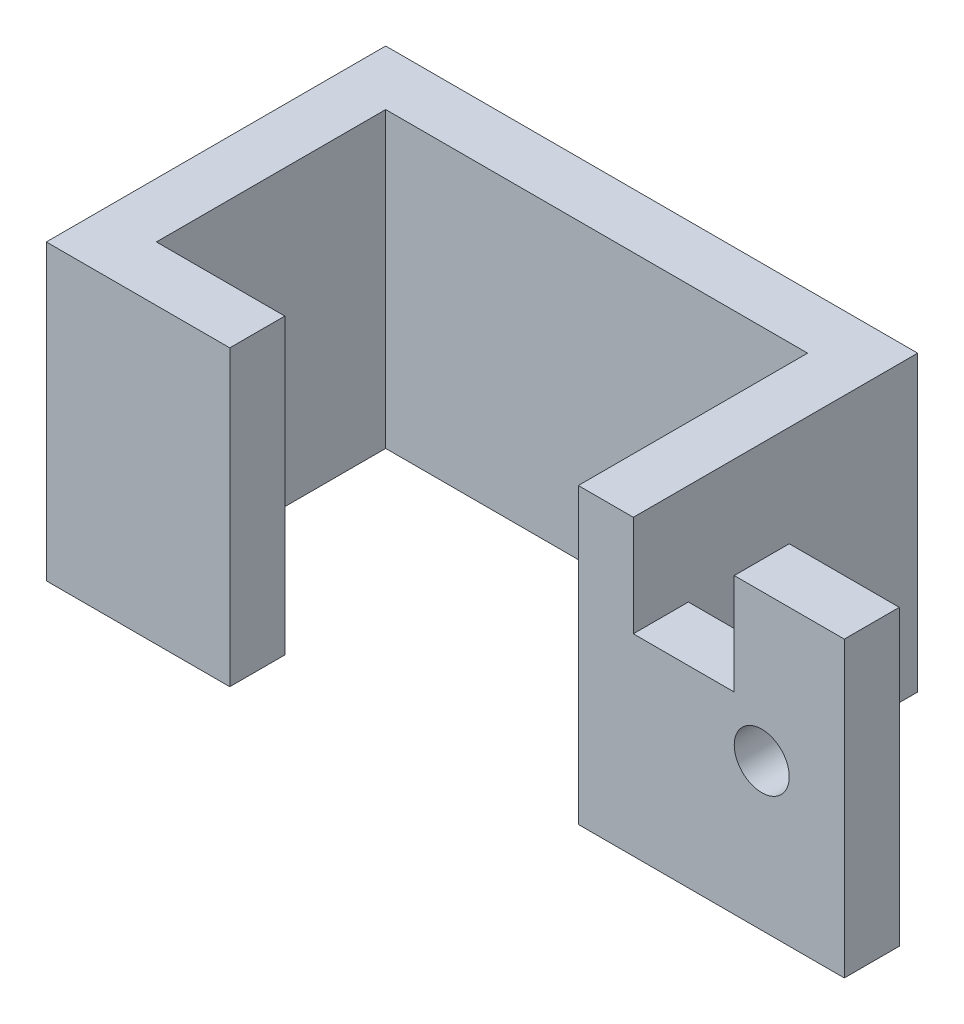
ISO-10303-21;
HEADER;
FILE_DESCRIPTION(('STEP AP214'),'2;1');
FILE_NAME('part.step','',(''),(''),'','','');
FILE_SCHEMA(('AUTOMOTIVE_DESIGN { 1 0 10303 214 1 1 1 1 }'));
ENDSEC;
DATA;
#1=APPLICATION_CONTEXT('core data for automotive mechanical design processes');
#2=APPLICATION_PROTOCOL_DEFINITION('international standard','automotive_design',2000,#1);
#3=PRODUCT_CONTEXT('',#1,'mechanical');
#4=PRODUCT('Part','Part','',(#3));
#5=PRODUCT_RELATED_PRODUCT_CATEGORY('part','',(#4));
#6=PRODUCT_DEFINITION_FORMATION('','',#4);
#7=PRODUCT_DEFINITION_CONTEXT('part definition',#1,'design');
#8=PRODUCT_DEFINITION('design','',#6,#7);
#9=PRODUCT_DEFINITION_SHAPE('','',#8);
#10=(LENGTH_UNIT() NAMED_UNIT(*) SI_UNIT(.MILLI.,.METRE.));
#11=(NAMED_UNIT(*) PLANE_ANGLE_UNIT() SI_UNIT($,.RADIAN.));
#12=(NAMED_UNIT(*) SI_UNIT($,.STERADIAN.) SOLID_ANGLE_UNIT());
#13=UNCERTAINTY_MEASURE_WITH_UNIT(LENGTH_MEASURE(1.E-05),#10,'distance_accuracy_value','');
#14=(GEOMETRIC_REPRESENTATION_CONTEXT(3) GLOBAL_UNCERTAINTY_ASSIGNED_CONTEXT((#13)) GLOBAL_UNIT_ASSIGNED_CONTEXT((#10,
#11,#12)) REPRESENTATION_CONTEXT('',''));
#15=CARTESIAN_POINT('',(0.,0.,0.));
#16=DIRECTION('',(0.,0.,1.));
#17=DIRECTION('',(1.,0.,0.));
#18=AXIS2_PLACEMENT_3D('',#15,#16,#17);
#19=CARTESIAN_POINT('',(0.,16.,0.));
#20=DIRECTION('',(0.,1.,0.));
#21=DIRECTION('',(0.,0.,1.));
#22=AXIS2_PLACEMENT_3D('',#19,#20,#21);
#23=PLANE('',#22);
#24=DIRECTION('',(0.,0.,-1.));
#25=VECTOR('',#24,1.);
#26=CARTESIAN_POINT('',(20.,16.,10.751));
#27=LINE('',#26,#25);
#28=CARTESIAN_POINT('',(20.,16.,7.75));
#29=VERTEX_POINT('',#28);
#30=CARTESIAN_POINT('',(20.,16.,4.75));
#31=VERTEX_POINT('',#30);
#32=EDGE_CURVE('E237',#29,#31,#27,.T.);
#33=ORIENTED_EDGE('',*,*,#32,.F.);
#34=DIRECTION('',(1.,0.,0.));
#35=VECTOR('',#34,1.);
#36=CARTESIAN_POINT('',(-14.5,16.,7.75));
#37=LINE('',#36,#35);
#38=CARTESIAN_POINT('',(26.,16.,7.75));
#39=VERTEX_POINT('',#38);
#40=EDGE_CURVE('E243',#29,#39,#37,.T.);
#41=ORIENTED_EDGE('',*,*,#40,.T.);
#42=DIRECTION('',(0.,0.,-1.));
#43=VECTOR('',#42,1.);
#44=CARTESIAN_POINT('',(26.,16.,7.75100000000001));
#45=LINE('',#44,#43);
#46=CARTESIAN_POINT('',(26.,16.,4.75));
#47=VERTEX_POINT('',#46);
#48=EDGE_CURVE('E291',#39,#47,#45,.T.);
#49=ORIENTED_EDGE('',*,*,#48,.T.);
#50=DIRECTION('',(-1.,0.,0.));
#51=VECTOR('',#50,1.);
#52=CARTESIAN_POINT('',(27.5,16.,4.75));
#53=LINE('',#52,#51);
#54=EDGE_CURVE('E361',#47,#31,#53,.T.);
#55=ORIENTED_EDGE('',*,*,#54,.T.);
#56=EDGE_LOOP('',(#33,#41,#49,#55));
#57=FACE_BOUND('',#56,.T.);
#58=ADVANCED_FACE('F39',(#57),#23,.T.);
#59=CARTESIAN_POINT('',(14.5,16.,-7.75));
#60=DIRECTION('',(-1.,0.,0.));
#61=DIRECTION('',(0.,0.,1.));
#62=AXIS2_PLACEMENT_3D('',#59,#60,#61);
#63=PLANE('',#62);
#64=DIRECTION('',(0.,1.,0.));
#65=VECTOR('',#64,1.);
#66=CARTESIAN_POINT('',(14.5,16.,4.75));
#67=LINE('',#66,#65);
#68=CARTESIAN_POINT('',(14.5,9.,4.75));
#69=VERTEX_POINT('',#68);
#70=CARTESIAN_POINT('',(14.5,10.5,4.75));
#71=VERTEX_POINT('',#70);
#72=EDGE_CURVE('E359',#69,#71,#67,.T.);
#73=ORIENTED_EDGE('',*,*,#72,.F.);
#74=CARTESIAN_POINT('',(14.5,9.,0.75));
#75=DIRECTION('',(-1.,0.,0.));
#76=DIRECTION('',(0.,0.,1.));
#77=AXIS2_PLACEMENT_3D('',#74,#75,#76);
#78=CIRCLE('',#77,4.);
#79=CARTESIAN_POINT('',(14.5,5.,0.749999999999999));
#80=VERTEX_POINT('',#79);
#81=EDGE_CURVE('E420',#69,#80,#78,.F.);
#82=ORIENTED_EDGE('',*,*,#81,.T.);
#83=DIRECTION('',(0.,0.,1.));
#84=VECTOR('',#83,1.);
#85=CARTESIAN_POINT('',(14.5,5.,-1.25));
#86=LINE('',#85,#84);
#87=CARTESIAN_POINT('',(14.5,5.,0.0857864376269022));
#88=VERTEX_POINT('',#87);
#89=EDGE_CURVE('E324',#88,#80,#86,.T.);
#90=ORIENTED_EDGE('',*,*,#89,.F.);
#91=CARTESIAN_POINT('',(14.5,5.,-1.25));
#92=VERTEX_POINT('',#91);
#93=EDGE_CURVE('E316',#92,#88,#86,.T.);
#94=ORIENTED_EDGE('',*,*,#93,.F.);
#95=DIRECTION('',(0.,1.,0.));
#96=VECTOR('',#95,1.);
#97=CARTESIAN_POINT('',(14.5,5.,-1.25));
#98=LINE('',#97,#96);
#99=CARTESIAN_POINT('',(14.5,0.,-1.25));
#100=VERTEX_POINT('',#99);
#101=EDGE_CURVE('E304',#100,#92,#98,.T.);
#102=ORIENTED_EDGE('',*,*,#101,.F.);
#103=DIRECTION('',(0.,0.,-1.));
#104=VECTOR('',#103,1.);
#105=CARTESIAN_POINT('',(14.5,0.,-7.75));
#106=LINE('',#105,#104);
#107=CARTESIAN_POINT('',(14.5,0.,-7.75));
#108=VERTEX_POINT('',#107);
#109=EDGE_CURVE('E391',#100,#108,#106,.T.);
#110=ORIENTED_EDGE('',*,*,#109,.T.);
#111=DIRECTION('',(0.,-1.,0.));
#112=VECTOR('',#111,1.);
#113=CARTESIAN_POINT('',(14.5,16.,-7.75));
#114=LINE('',#113,#112);
#115=CARTESIAN_POINT('',(14.5,16.,-7.75));
#116=VERTEX_POINT('',#115);
#117=EDGE_CURVE('E412',#116,#108,#114,.T.);
#118=ORIENTED_EDGE('',*,*,#117,.F.);
#119=DIRECTION('',(0.,0.,-1.));
#120=VECTOR('',#119,1.);
#121=CARTESIAN_POINT('',(14.5,16.,-7.75));
#122=LINE('',#121,#120);
#123=CARTESIAN_POINT('',(14.5,16.,7.75));
#124=VERTEX_POINT('',#123);
#125=EDGE_CURVE('E392',#124,#116,#122,.T.);
#126=ORIENTED_EDGE('',*,*,#125,.F.);
#127=DIRECTION('',(0.,-1.,0.));
#128=VECTOR('',#127,1.);
#129=CARTESIAN_POINT('',(14.5,10.5,7.75));
#130=LINE('',#129,#128);
#131=CARTESIAN_POINT('',(14.5,10.5,7.75));
#132=VERTEX_POINT('',#131);
#133=EDGE_CURVE('E244',#124,#132,#130,.T.);
#134=ORIENTED_EDGE('',*,*,#133,.T.);
#135=DIRECTION('',(0.,0.,-1.));
#136=VECTOR('',#135,1.);
#137=CARTESIAN_POINT('',(14.5,10.5,10.751));
#138=LINE('',#137,#136);
#139=EDGE_CURVE('E226',#132,#71,#138,.T.);
#140=ORIENTED_EDGE('',*,*,#139,.T.);
#141=EDGE_LOOP('',(#73,#82,#90,#94,#102,#110,#118,#126,#134,#140));
#142=FACE_BOUND('',#141,.T.);
#143=ADVANCED_FACE('F445',(#142),#63,.F.);
#144=CARTESIAN_POINT('',(27.5,16.,4.75));
#145=DIRECTION('',(0.,0.,1.));
#146=DIRECTION('',(0.,-1.,0.));
#147=AXIS2_PLACEMENT_3D('',#144,#145,#146);
#148=PLANE('',#147);
#149=CARTESIAN_POINT('',(21.5,8.,4.75));
#150=DIRECTION('',(0.,0.,-1.));
#151=DIRECTION('',(0.,1.,0.));
#152=AXIS2_PLACEMENT_3D('',#149,#150,#151);
#153=CIRCLE('',#152,1.5);
#154=CARTESIAN_POINT('',(20.3819660112501,9.,4.75));
#155=VERTEX_POINT('',#154);
#156=CARTESIAN_POINT('',(20.5,6.8819660112501,4.75));
#157=VERTEX_POINT('',#156);
#158=EDGE_CURVE('E294',#155,#157,#153,.T.);
#159=ORIENTED_EDGE('',*,*,#158,.F.);
#160=DIRECTION('',(-1.,0.,0.));
#161=VECTOR('',#160,1.);
#162=CARTESIAN_POINT('',(14.5,9.,4.75));
#163=LINE('',#162,#161);
#164=EDGE_CURVE('E417',#155,#69,#163,.T.);
#165=ORIENTED_EDGE('',*,*,#164,.T.);
#166=ORIENTED_EDGE('',*,*,#72,.T.);
#167=DIRECTION('',(-1.,0.,0.));
#168=VECTOR('',#167,1.);
#169=CARTESIAN_POINT('',(14.5,10.5,4.75));
#170=LINE('',#169,#168);
#171=CARTESIAN_POINT('',(20.,10.5,4.75));
#172=VERTEX_POINT('',#171);
#173=EDGE_CURVE('E227',#172,#71,#170,.T.);
#174=ORIENTED_EDGE('',*,*,#173,.F.);
#175=DIRECTION('',(0.,-1.,0.));
#176=VECTOR('',#175,1.);
#177=CARTESIAN_POINT('',(20.,10.5,4.75));
#178=LINE('',#177,#176);
#179=EDGE_CURVE('E222',#31,#172,#178,.T.);
#180=ORIENTED_EDGE('',*,*,#179,.F.);
#181=ORIENTED_EDGE('',*,*,#54,.F.);
#182=DIRECTION('',(0.,1.,0.));
#183=VECTOR('',#182,1.);
#184=CARTESIAN_POINT('',(26.,0.,4.75));
#185=LINE('',#184,#183);
#186=CARTESIAN_POINT('',(26.,0.,4.75));
#187=VERTEX_POINT('',#186);
#188=EDGE_CURVE('E288',#187,#47,#185,.T.);
#189=ORIENTED_EDGE('',*,*,#188,.F.);
#190=DIRECTION('',(-1.,0.,0.));
#191=VECTOR('',#190,1.);
#192=CARTESIAN_POINT('',(27.5,0.,4.75));
#193=LINE('',#192,#191);
#194=CARTESIAN_POINT('',(20.5,0.,4.75));
#195=VERTEX_POINT('',#194);
#196=EDGE_CURVE('E364',#187,#195,#193,.T.);
#197=ORIENTED_EDGE('',*,*,#196,.T.);
#198=DIRECTION('',(0.,-1.,0.));
#199=VECTOR('',#198,1.);
#200=CARTESIAN_POINT('',(20.5,5.,4.75));
#201=LINE('',#200,#199);
#202=EDGE_CURVE('E415',#195,#157,#201,.F.);
#203=ORIENTED_EDGE('',*,*,#202,.T.);
#204=EDGE_LOOP('',(#159,#165,#166,#174,#180,#181,#189,#197,#203));
#205=FACE_BOUND('',#204,.T.);
#206=ADVANCED_FACE('F448',(#205),#148,.F.);
#207=CARTESIAN_POINT('',(-14.5,16.,-7.75));
#208=DIRECTION('',(1.,0.,0.));
#209=DIRECTION('',(0.,0.,-1.));
#210=AXIS2_PLACEMENT_3D('',#207,#208,#209);
#211=PLANE('',#210);
#212=DIRECTION('',(0.,0.,-1.));
#213=VECTOR('',#212,1.);
#214=CARTESIAN_POINT('',(-14.5,5.,-1.25));
#215=LINE('',#214,#213);
#216=CARTESIAN_POINT('',(-14.5,5.,4.75));
#217=VERTEX_POINT('',#216);
#218=CARTESIAN_POINT('',(-14.5,5.,2.9142135623731));
#219=VERTEX_POINT('',#218);
#220=EDGE_CURVE('E345',#217,#219,#215,.T.);
#221=ORIENTED_EDGE('',*,*,#220,.F.);
#222=DIRECTION('',(0.,-1.,0.));
#223=VECTOR('',#222,1.);
#224=CARTESIAN_POINT('',(-14.5,0.,4.75));
#225=LINE('',#224,#223);
#226=CARTESIAN_POINT('',(-14.5,0.,4.75));
#227=VERTEX_POINT('',#226);
#228=EDGE_CURVE('E270',#217,#227,#225,.T.);
#229=ORIENTED_EDGE('',*,*,#228,.T.);
#230=DIRECTION('',(0.,0.,-1.));
#231=VECTOR('',#230,1.);
#232=CARTESIAN_POINT('',(-14.5,0.,7.75100000000002));
#233=LINE('',#232,#231);
#234=CARTESIAN_POINT('',(-14.5,0.,10.75));
#235=VERTEX_POINT('',#234);
#236=EDGE_CURVE('E283',#235,#227,#233,.T.);
#237=ORIENTED_EDGE('',*,*,#236,.F.);
#238=DIRECTION('',(0.,1.,0.));
#239=VECTOR('',#238,1.);
#240=CARTESIAN_POINT('',(-14.5,16.,10.75));
#241=LINE('',#240,#239);
#242=CARTESIAN_POINT('',(-14.5,16.,10.75));
#243=VERTEX_POINT('',#242);
#244=EDGE_CURVE('E236',#235,#243,#241,.T.);
#245=ORIENTED_EDGE('',*,*,#244,.T.);
#246=DIRECTION('',(0.,0.,1.));
#247=VECTOR('',#246,1.);
#248=CARTESIAN_POINT('',(-14.5,16.,-7.75));
#249=LINE('',#248,#247);
#250=CARTESIAN_POINT('',(-14.5,16.,-7.75));
#251=VERTEX_POINT('',#250);
#252=EDGE_CURVE('E397',#251,#243,#249,.T.);
#253=ORIENTED_EDGE('',*,*,#252,.F.);
#254=DIRECTION('',(0.,-1.,0.));
#255=VECTOR('',#254,1.);
#256=CARTESIAN_POINT('',(-14.5,16.,-7.75));
#257=LINE('',#256,#255);
#258=CARTESIAN_POINT('',(-14.5,0.,-7.75));
#259=VERTEX_POINT('',#258);
#260=EDGE_CURVE('E402',#251,#259,#257,.T.);
#261=ORIENTED_EDGE('',*,*,#260,.T.);
#262=DIRECTION('',(0.,0.,1.));
#263=VECTOR('',#262,1.);
#264=CARTESIAN_POINT('',(-14.5,0.,-7.75));
#265=LINE('',#264,#263);
#266=CARTESIAN_POINT('',(-14.5,0.,-1.25));
#267=VERTEX_POINT('',#266);
#268=EDGE_CURVE('E406',#259,#267,#265,.T.);
#269=ORIENTED_EDGE('',*,*,#268,.T.);
#270=DIRECTION('',(0.,-1.,0.));
#271=VECTOR('',#270,1.);
#272=CARTESIAN_POINT('',(-14.5,0.,-1.25));
#273=LINE('',#272,#271);
#274=CARTESIAN_POINT('',(-14.5,5.,-1.25));
#275=VERTEX_POINT('',#274);
#276=EDGE_CURVE('E337',#275,#267,#273,.T.);
#277=ORIENTED_EDGE('',*,*,#276,.F.);
#278=CARTESIAN_POINT('',(-14.5,5.,0.0857864376269026));
#279=VERTEX_POINT('',#278);
#280=EDGE_CURVE('E332',#279,#275,#215,.T.);
#281=ORIENTED_EDGE('',*,*,#280,.F.);
#282=EDGE_CURVE('E348',#219,#279,#215,.T.);
#283=ORIENTED_EDGE('',*,*,#282,.F.);
#284=EDGE_LOOP('',(#221,#229,#237,#245,#253,#261,#269,#277,#281,#283));
#285=FACE_BOUND('',#284,.T.);
#286=ADVANCED_FACE('F455',(#285),#211,.F.);
#287=CARTESIAN_POINT('',(-14.5,16.,7.75));
#288=DIRECTION('',(0.,0.,-1.));
#289=DIRECTION('',(-1.,0.,0.));
#290=AXIS2_PLACEMENT_3D('',#287,#288,#289);
#291=PLANE('',#290);
#292=ORIENTED_EDGE('',*,*,#40,.F.);
#293=DIRECTION('',(0.,1.,0.));
#294=VECTOR('',#293,1.);
#295=CARTESIAN_POINT('',(20.,10.5,7.75));
#296=LINE('',#295,#294);
#297=CARTESIAN_POINT('',(20.,10.5,7.75));
#298=VERTEX_POINT('',#297);
#299=EDGE_CURVE('E219',#298,#29,#296,.T.);
#300=ORIENTED_EDGE('',*,*,#299,.F.);
#301=DIRECTION('',(1.,0.,0.));
#302=VECTOR('',#301,1.);
#303=CARTESIAN_POINT('',(14.5,10.5,7.75));
#304=LINE('',#303,#302);
#305=EDGE_CURVE('E230',#132,#298,#304,.T.);
#306=ORIENTED_EDGE('',*,*,#305,.F.);
#307=ORIENTED_EDGE('',*,*,#133,.F.);
#308=CARTESIAN_POINT('',(11.5,16.,7.75));
#309=VERTEX_POINT('',#308);
#310=EDGE_CURVE('E399',#309,#124,#37,.T.);
#311=ORIENTED_EDGE('',*,*,#310,.F.);
#312=DIRECTION('',(0.,1.,0.));
#313=VECTOR('',#312,1.);
#314=CARTESIAN_POINT('',(11.5,-0.001000000000001,7.75));
#315=LINE('',#314,#313);
#316=CARTESIAN_POINT('',(11.5,0.,7.75));
#317=VERTEX_POINT('',#316);
#318=EDGE_CURVE('E380',#317,#309,#315,.T.);
#319=ORIENTED_EDGE('',*,*,#318,.F.);
#320=DIRECTION('',(1.,0.,0.));
#321=VECTOR('',#320,1.);
#322=CARTESIAN_POINT('',(-14.5,0.,7.75));
#323=LINE('',#322,#321);
#324=CARTESIAN_POINT('',(26.,0.,7.75));
#325=VERTEX_POINT('',#324);
#326=EDGE_CURVE('E395',#317,#325,#323,.T.);
#327=ORIENTED_EDGE('',*,*,#326,.T.);
#328=DIRECTION('',(0.,-1.,0.));
#329=VECTOR('',#328,1.);
#330=CARTESIAN_POINT('',(26.,0.,7.75));
#331=LINE('',#330,#329);
#332=EDGE_CURVE('E286',#39,#325,#331,.T.);
#333=ORIENTED_EDGE('',*,*,#332,.F.);
#334=EDGE_LOOP('',(#292,#300,#306,#307,#311,#319,#327,#333));
#335=FACE_BOUND('',#334,.T.);
#336=CARTESIAN_POINT('',(21.5,8.,7.75));
#337=DIRECTION('',(0.,0.,-1.));
#338=DIRECTION('',(-1.,0.,0.));
#339=AXIS2_PLACEMENT_3D('',#336,#337,#338);
#340=CIRCLE('',#339,1.5);
#341=CARTESIAN_POINT('',(20.,8.,7.75));
#342=VERTEX_POINT('',#341);
#343=EDGE_CURVE('E297',#342,#342,#340,.F.);
#344=ORIENTED_EDGE('',*,*,#343,.F.);
#345=EDGE_LOOP('',(#344));
#346=FACE_BOUND('',#345,.T.);
#347=ADVANCED_FACE('F240',(#335,#346),#291,.F.);
#348=CARTESIAN_POINT('',(-14.5,16.,-7.75));
#349=DIRECTION('',(0.,0.,1.));
#350=DIRECTION('',(1.,0.,0.));
#351=AXIS2_PLACEMENT_3D('',#348,#349,#350);
#352=PLANE('',#351);
#353=DIRECTION('',(-1.,0.,0.));
#354=VECTOR('',#353,1.);
#355=CARTESIAN_POINT('',(-14.5,0.,-7.75));
#356=LINE('',#355,#354);
#357=EDGE_CURVE('E404',#108,#259,#356,.T.);
#358=ORIENTED_EDGE('',*,*,#357,.T.);
#359=ORIENTED_EDGE('',*,*,#260,.F.);
#360=DIRECTION('',(-1.,0.,0.));
#361=VECTOR('',#360,1.);
#362=CARTESIAN_POINT('',(-14.5,16.,-7.75));
#363=LINE('',#362,#361);
#364=EDGE_CURVE('E394',#116,#251,#363,.T.);
#365=ORIENTED_EDGE('',*,*,#364,.F.);
#366=ORIENTED_EDGE('',*,*,#117,.T.);
#367=EDGE_LOOP('',(#358,#359,#365,#366));
#368=FACE_BOUND('',#367,.T.);
#369=ADVANCED_FACE('F450',(#368),#352,.F.);
#370=ORIENTED_EDGE('',*,*,#310,.T.);
#371=ORIENTED_EDGE('',*,*,#125,.T.);
#372=ORIENTED_EDGE('',*,*,#364,.T.);
#373=ORIENTED_EDGE('',*,*,#252,.T.);
#374=DIRECTION('',(-1.,0.,0.));
#375=VECTOR('',#374,1.);
#376=CARTESIAN_POINT('',(-4.5,16.,10.75));
#377=LINE('',#376,#375);
#378=CARTESIAN_POINT('',(-4.5,16.,10.75));
#379=VERTEX_POINT('',#378);
#380=EDGE_CURVE('E264',#379,#243,#377,.T.);
#381=ORIENTED_EDGE('',*,*,#380,.F.);
#382=DIRECTION('',(0.,0.,-1.));
#383=VECTOR('',#382,1.);
#384=CARTESIAN_POINT('',(-4.5,16.,7.75));
#385=LINE('',#384,#383);
#386=CARTESIAN_POINT('',(-4.5,16.,7.75));
#387=VERTEX_POINT('',#386);
#388=EDGE_CURVE('E255',#379,#387,#385,.T.);
#389=ORIENTED_EDGE('',*,*,#388,.T.);
#390=DIRECTION('',(-1.,0.,0.));
#391=VECTOR('',#390,1.);
#392=CARTESIAN_POINT('',(-4.5,16.,7.75));
#393=LINE('',#392,#391);
#394=CARTESIAN_POINT('',(-11.5,16.,7.75));
#395=VERTEX_POINT('',#394);
#396=EDGE_CURVE('E274',#387,#395,#393,.T.);
#397=ORIENTED_EDGE('',*,*,#396,.T.);
#398=DIRECTION('',(0.,0.,1.));
#399=VECTOR('',#398,1.);
#400=CARTESIAN_POINT('',(-11.5,16.,-4.75));
#401=LINE('',#400,#399);
#402=CARTESIAN_POINT('',(-11.5,16.,-4.75));
#403=VERTEX_POINT('',#402);
#404=EDGE_CURVE('E377',#403,#395,#401,.T.);
#405=ORIENTED_EDGE('',*,*,#404,.F.);
#406=DIRECTION('',(-1.,0.,0.));
#407=VECTOR('',#406,1.);
#408=CARTESIAN_POINT('',(-11.5,16.,-4.75));
#409=LINE('',#408,#407);
#410=CARTESIAN_POINT('',(11.5,16.,-4.75));
#411=VERTEX_POINT('',#410);
#412=EDGE_CURVE('E374',#411,#403,#409,.T.);
#413=ORIENTED_EDGE('',*,*,#412,.F.);
#414=DIRECTION('',(0.,0.,-1.));
#415=VECTOR('',#414,1.);
#416=CARTESIAN_POINT('',(11.5,16.,-4.75));
#417=LINE('',#416,#415);
#418=EDGE_CURVE('E371',#309,#411,#417,.T.);
#419=ORIENTED_EDGE('',*,*,#418,.F.);
#420=EDGE_LOOP('',(#370,#371,#372,#373,#381,#389,#397,#405,#413,#419));
#421=FACE_BOUND('',#420,.T.);
#422=ADVANCED_FACE('F453',(#421),#23,.T.);
#423=CARTESIAN_POINT('',(0.,0.,0.));
#424=DIRECTION('',(0.,1.,0.));
#425=DIRECTION('',(0.,0.,1.));
#426=AXIS2_PLACEMENT_3D('',#423,#424,#425);
#427=PLANE('',#426);
#428=CARTESIAN_POINT('',(-14.,0.,1.5));
#429=DIRECTION('',(0.,-1.,0.));
#430=DIRECTION('',(0.,0.,-1.));
#431=AXIS2_PLACEMENT_3D('',#428,#429,#430);
#432=CIRCLE('',#431,1.5);
#433=CARTESIAN_POINT('',(-14.,0.,0.));
#434=VERTEX_POINT('',#433);
#435=EDGE_CURVE('E306',#434,#434,#432,.T.);
#436=ORIENTED_EDGE('',*,*,#435,.F.);
#437=EDGE_LOOP('',(#436));
#438=FACE_BOUND('',#437,.T.);
#439=CARTESIAN_POINT('',(14.,0.,1.5));
#440=DIRECTION('',(0.,-1.,0.));
#441=DIRECTION('',(0.,0.,-1.));
#442=AXIS2_PLACEMENT_3D('',#439,#440,#441);
#443=CIRCLE('',#442,1.5);
#444=CARTESIAN_POINT('',(14.,0.,0.));
#445=VERTEX_POINT('',#444);
#446=EDGE_CURVE('E300',#445,#445,#443,.T.);
#447=ORIENTED_EDGE('',*,*,#446,.F.);
#448=EDGE_LOOP('',(#447));
#449=FACE_BOUND('',#448,.T.);
#450=DIRECTION('',(0.,0.,-1.));
#451=VECTOR('',#450,1.);
#452=CARTESIAN_POINT('',(-11.5,0.,-4.75));
#453=LINE('',#452,#451);
#454=CARTESIAN_POINT('',(-11.5,0.,7.75));
#455=VERTEX_POINT('',#454);
#456=CARTESIAN_POINT('',(-11.5,0.,-4.75));
#457=VERTEX_POINT('',#456);
#458=EDGE_CURVE('E367',#455,#457,#453,.T.);
#459=ORIENTED_EDGE('',*,*,#458,.F.);
#460=DIRECTION('',(-1.,0.,0.));
#461=VECTOR('',#460,1.);
#462=CARTESIAN_POINT('',(-4.5,0.,7.75));
#463=LINE('',#462,#461);
#464=CARTESIAN_POINT('',(-4.5,0.,7.75));
#465=VERTEX_POINT('',#464);
#466=EDGE_CURVE('E271',#465,#455,#463,.T.);
#467=ORIENTED_EDGE('',*,*,#466,.F.);
#468=DIRECTION('',(0.,0.,1.));
#469=VECTOR('',#468,1.);
#470=CARTESIAN_POINT('',(-4.5,0.,7.75));
#471=LINE('',#470,#469);
#472=CARTESIAN_POINT('',(-4.5,0.,10.75));
#473=VERTEX_POINT('',#472);
#474=EDGE_CURVE('E261',#465,#473,#471,.T.);
#475=ORIENTED_EDGE('',*,*,#474,.T.);
#476=DIRECTION('',(-1.,0.,0.));
#477=VECTOR('',#476,1.);
#478=CARTESIAN_POINT('',(-4.5,0.,10.75));
#479=LINE('',#478,#477);
#480=EDGE_CURVE('E267',#473,#235,#479,.T.);
#481=ORIENTED_EDGE('',*,*,#480,.T.);
#482=ORIENTED_EDGE('',*,*,#236,.T.);
#483=DIRECTION('',(-1.,0.,0.));
#484=VECTOR('',#483,1.);
#485=CARTESIAN_POINT('',(-27.5,0.,4.75));
#486=LINE('',#485,#484);
#487=CARTESIAN_POINT('',(-16.5,0.,4.75));
#488=VERTEX_POINT('',#487);
#489=EDGE_CURVE('E280',#227,#488,#486,.T.);
#490=ORIENTED_EDGE('',*,*,#489,.T.);
#491=DIRECTION('',(0.,0.,1.));
#492=VECTOR('',#491,1.);
#493=CARTESIAN_POINT('',(-16.5,0.,-1.25));
#494=LINE('',#493,#492);
#495=CARTESIAN_POINT('',(-16.5,0.,-1.25));
#496=VERTEX_POINT('',#495);
#497=EDGE_CURVE('E341',#496,#488,#494,.T.);
#498=ORIENTED_EDGE('',*,*,#497,.F.);
#499=DIRECTION('',(1.,0.,0.));
#500=VECTOR('',#499,1.);
#501=CARTESIAN_POINT('',(-16.5,0.,-1.25));
#502=LINE('',#501,#500);
#503=EDGE_CURVE('E344',#496,#267,#502,.T.);
#504=ORIENTED_EDGE('',*,*,#503,.T.);
#505=ORIENTED_EDGE('',*,*,#268,.F.);
#506=ORIENTED_EDGE('',*,*,#357,.F.);
#507=ORIENTED_EDGE('',*,*,#109,.F.);
#508=DIRECTION('',(-1.,0.,0.));
#509=VECTOR('',#508,1.);
#510=CARTESIAN_POINT('',(16.5,0.,-1.25));
#511=LINE('',#510,#509);
#512=CARTESIAN_POINT('',(16.5,0.,-1.25));
#513=VERTEX_POINT('',#512);
#514=EDGE_CURVE('E329',#513,#100,#511,.T.);
#515=ORIENTED_EDGE('',*,*,#514,.F.);
#516=DIRECTION('',(0.,0.,-1.));
#517=VECTOR('',#516,1.);
#518=CARTESIAN_POINT('',(16.5,0.,-1.25));
#519=LINE('',#518,#517);
#520=CARTESIAN_POINT('',(16.5,0.,0.749999999999999));
#521=VERTEX_POINT('',#520);
#522=EDGE_CURVE('E313',#521,#513,#519,.T.);
#523=ORIENTED_EDGE('',*,*,#522,.F.);
#524=CARTESIAN_POINT('',(20.5,0.,0.749999999999999));
#525=DIRECTION('',(0.,1.,0.));
#526=DIRECTION('',(0.,0.,1.));
#527=AXIS2_PLACEMENT_3D('',#524,#525,#526);
#528=CIRCLE('',#527,4.);
#529=EDGE_CURVE('E49',#521,#195,#528,.T.);
#530=ORIENTED_EDGE('',*,*,#529,.T.);
#531=ORIENTED_EDGE('',*,*,#196,.F.);
#532=DIRECTION('',(0.,0.,-1.));
#533=VECTOR('',#532,1.);
#534=CARTESIAN_POINT('',(26.,0.,7.751));
#535=LINE('',#534,#533);
#536=EDGE_CURVE('E290',#325,#187,#535,.T.);
#537=ORIENTED_EDGE('',*,*,#536,.F.);
#538=ORIENTED_EDGE('',*,*,#326,.F.);
#539=DIRECTION('',(0.,0.,1.));
#540=VECTOR('',#539,1.);
#541=CARTESIAN_POINT('',(11.5,0.,-4.75));
#542=LINE('',#541,#540);
#543=CARTESIAN_POINT('',(11.5,0.,-4.75));
#544=VERTEX_POINT('',#543);
#545=EDGE_CURVE('E369',#544,#317,#542,.T.);
#546=ORIENTED_EDGE('',*,*,#545,.F.);
#547=DIRECTION('',(1.,0.,0.));
#548=VECTOR('',#547,1.);
#549=CARTESIAN_POINT('',(-11.5,0.,-4.75));
#550=LINE('',#549,#548);
#551=EDGE_CURVE('E382',#457,#544,#550,.T.);
#552=ORIENTED_EDGE('',*,*,#551,.F.);
#553=EDGE_LOOP('',(#459,#467,#475,#481,#482,#490,#498,#504,#505,#506,#507,#515,#523,#530,#531,
#537,#538,#546,#552));
#554=FACE_BOUND('',#553,.T.);
#555=ADVANCED_FACE('F461',(#438,#449,#554),#427,.F.);
#556=CARTESIAN_POINT('',(11.5,-0.001000000000001,-4.75));
#557=DIRECTION('',(1.,0.,0.));
#558=DIRECTION('',(0.,0.,-1.));
#559=AXIS2_PLACEMENT_3D('',#556,#557,#558);
#560=PLANE('',#559);
#561=ORIENTED_EDGE('',*,*,#545,.T.);
#562=ORIENTED_EDGE('',*,*,#318,.T.);
#563=ORIENTED_EDGE('',*,*,#418,.T.);
#564=DIRECTION('',(0.,1.,0.));
#565=VECTOR('',#564,1.);
#566=CARTESIAN_POINT('',(11.5,-0.001000000000001,-4.75));
#567=LINE('',#566,#565);
#568=EDGE_CURVE('E379',#544,#411,#567,.T.);
#569=ORIENTED_EDGE('',*,*,#568,.F.);
#570=EDGE_LOOP('',(#561,#562,#563,#569));
#571=FACE_BOUND('',#570,.T.);
#572=ADVANCED_FACE('F464',(#571),#560,.F.);
#573=CARTESIAN_POINT('',(-11.5,-0.001000000000001,-4.75));
#574=DIRECTION('',(-1.,0.,0.));
#575=DIRECTION('',(0.,0.,1.));
#576=AXIS2_PLACEMENT_3D('',#573,#574,#575);
#577=PLANE('',#576);
#578=ORIENTED_EDGE('',*,*,#458,.T.);
#579=DIRECTION('',(0.,1.,0.));
#580=VECTOR('',#579,1.);
#581=CARTESIAN_POINT('',(-11.5,-0.001000000000001,-4.75));
#582=LINE('',#581,#580);
#583=EDGE_CURVE('E386',#457,#403,#582,.T.);
#584=ORIENTED_EDGE('',*,*,#583,.T.);
#585=ORIENTED_EDGE('',*,*,#404,.T.);
#586=DIRECTION('',(0.,1.,0.));
#587=VECTOR('',#586,1.);
#588=CARTESIAN_POINT('',(-11.5,-0.001000000000001,7.75));
#589=LINE('',#588,#587);
#590=EDGE_CURVE('E383',#455,#395,#589,.T.);
#591=ORIENTED_EDGE('',*,*,#590,.F.);
#592=EDGE_LOOP('',(#578,#584,#585,#591));
#593=FACE_BOUND('',#592,.T.);
#594=ADVANCED_FACE('F471',(#593),#577,.F.);
#595=CARTESIAN_POINT('',(-11.5,-0.001000000000001,-4.75));
#596=DIRECTION('',(0.,0.,-1.));
#597=DIRECTION('',(-1.,0.,0.));
#598=AXIS2_PLACEMENT_3D('',#595,#596,#597);
#599=PLANE('',#598);
#600=ORIENTED_EDGE('',*,*,#551,.T.);
#601=ORIENTED_EDGE('',*,*,#568,.T.);
#602=ORIENTED_EDGE('',*,*,#412,.T.);
#603=ORIENTED_EDGE('',*,*,#583,.F.);
#604=EDGE_LOOP('',(#600,#601,#602,#603));
#605=FACE_BOUND('',#604,.T.);
#606=ADVANCED_FACE('F473',(#605),#599,.F.);
#607=CARTESIAN_POINT('',(-16.5,5.,-1.25));
#608=DIRECTION('',(0.,-1.,0.));
#609=DIRECTION('',(0.,0.,-1.));
#610=AXIS2_PLACEMENT_3D('',#607,#608,#609);
#611=PLANE('',#610);
#612=ORIENTED_EDGE('',*,*,#220,.T.);
#613=CARTESIAN_POINT('',(-14.,5.,1.5));
#614=DIRECTION('',(0.,-1.,0.));
#615=DIRECTION('',(0.,0.,-1.));
#616=AXIS2_PLACEMENT_3D('',#613,#614,#615);
#617=CIRCLE('',#616,1.5);
#618=EDGE_CURVE('E301',#219,#279,#617,.T.);
#619=ORIENTED_EDGE('',*,*,#618,.T.);
#620=ORIENTED_EDGE('',*,*,#280,.T.);
#621=DIRECTION('',(1.,0.,0.));
#622=VECTOR('',#621,1.);
#623=CARTESIAN_POINT('',(-16.5,5.,-1.25));
#624=LINE('',#623,#622);
#625=CARTESIAN_POINT('',(-16.5,5.,-1.25));
#626=VERTEX_POINT('',#625);
#627=EDGE_CURVE('E353',#626,#275,#624,.T.);
#628=ORIENTED_EDGE('',*,*,#627,.F.);
#629=DIRECTION('',(0.,0.,-1.));
#630=VECTOR('',#629,1.);
#631=CARTESIAN_POINT('',(-16.5,5.,-1.25));
#632=LINE('',#631,#630);
#633=CARTESIAN_POINT('',(-16.5,5.,4.75));
#634=VERTEX_POINT('',#633);
#635=EDGE_CURVE('E336',#634,#626,#632,.T.);
#636=ORIENTED_EDGE('',*,*,#635,.F.);
#637=DIRECTION('',(1.,0.,0.));
#638=VECTOR('',#637,1.);
#639=CARTESIAN_POINT('',(-16.5,5.,4.75));
#640=LINE('',#639,#638);
#641=EDGE_CURVE('E356',#634,#217,#640,.T.);
#642=ORIENTED_EDGE('',*,*,#641,.T.);
#643=EDGE_LOOP('',(#612,#619,#620,#628,#636,#642));
#644=FACE_BOUND('',#643,.T.);
#645=ADVANCED_FACE('F476',(#644),#611,.F.);
#646=CARTESIAN_POINT('',(-16.5,0.,-1.25));
#647=DIRECTION('',(0.,0.,1.));
#648=DIRECTION('',(1.,0.,0.));
#649=AXIS2_PLACEMENT_3D('',#646,#647,#648);
#650=PLANE('',#649);
#651=ORIENTED_EDGE('',*,*,#276,.T.);
#652=ORIENTED_EDGE('',*,*,#503,.F.);
#653=DIRECTION('',(0.,-1.,0.));
#654=VECTOR('',#653,1.);
#655=CARTESIAN_POINT('',(-16.5,0.,-1.25));
#656=LINE('',#655,#654);
#657=EDGE_CURVE('E339',#626,#496,#656,.T.);
#658=ORIENTED_EDGE('',*,*,#657,.F.);
#659=ORIENTED_EDGE('',*,*,#627,.T.);
#660=EDGE_LOOP('',(#651,#652,#658,#659));
#661=FACE_BOUND('',#660,.T.);
#662=ADVANCED_FACE('F486',(#661),#650,.F.);
#663=CARTESIAN_POINT('',(-16.5,0.,0.));
#664=DIRECTION('',(1.,0.,0.));
#665=DIRECTION('',(0.,0.,-1.));
#666=AXIS2_PLACEMENT_3D('',#663,#664,#665);
#667=PLANE('',#666);
#668=DIRECTION('',(0.,1.,0.));
#669=VECTOR('',#668,1.);
#670=CARTESIAN_POINT('',(-16.5,0.,4.75));
#671=LINE('',#670,#669);
#672=EDGE_CURVE('E333',#488,#634,#671,.T.);
#673=ORIENTED_EDGE('',*,*,#672,.T.);
#674=ORIENTED_EDGE('',*,*,#635,.T.);
#675=ORIENTED_EDGE('',*,*,#657,.T.);
#676=ORIENTED_EDGE('',*,*,#497,.T.);
#677=EDGE_LOOP('',(#673,#674,#675,#676));
#678=FACE_BOUND('',#677,.T.);
#679=ADVANCED_FACE('F490',(#678),#667,.F.);
#680=CARTESIAN_POINT('',(16.5,5.,-1.25));
#681=DIRECTION('',(0.,0.,1.));
#682=DIRECTION('',(0.,-1.,0.));
#683=AXIS2_PLACEMENT_3D('',#680,#681,#682);
#684=PLANE('',#683);
#685=ORIENTED_EDGE('',*,*,#101,.T.);
#686=DIRECTION('',(-1.,0.,0.));
#687=VECTOR('',#686,1.);
#688=CARTESIAN_POINT('',(16.5,5.,-1.25));
#689=LINE('',#688,#687);
#690=CARTESIAN_POINT('',(16.5,5.,-1.25));
#691=VERTEX_POINT('',#690);
#692=EDGE_CURVE('E321',#691,#92,#689,.T.);
#693=ORIENTED_EDGE('',*,*,#692,.F.);
#694=DIRECTION('',(0.,1.,0.));
#695=VECTOR('',#694,1.);
#696=CARTESIAN_POINT('',(16.5,5.,-1.25));
#697=LINE('',#696,#695);
#698=EDGE_CURVE('E315',#513,#691,#697,.T.);
#699=ORIENTED_EDGE('',*,*,#698,.F.);
#700=ORIENTED_EDGE('',*,*,#514,.T.);
#701=EDGE_LOOP('',(#685,#693,#699,#700));
#702=FACE_BOUND('',#701,.T.);
#703=ADVANCED_FACE('F494',(#702),#684,.F.);
#704=CARTESIAN_POINT('',(16.5,5.,-1.25));
#705=DIRECTION('',(0.,-1.,0.));
#706=DIRECTION('',(0.,0.,-1.));
#707=AXIS2_PLACEMENT_3D('',#704,#705,#706);
#708=PLANE('',#707);
#709=CARTESIAN_POINT('',(14.,5.,1.5));
#710=DIRECTION('',(0.,-1.,0.));
#711=DIRECTION('',(0.,0.,-1.));
#712=AXIS2_PLACEMENT_3D('',#709,#710,#711);
#713=CIRCLE('',#712,1.5);
#714=CARTESIAN_POINT('',(15.2990381056767,5.,0.749999999999999));
#715=VERTEX_POINT('',#714);
#716=EDGE_CURVE('E309',#88,#715,#713,.T.);
#717=ORIENTED_EDGE('',*,*,#716,.T.);
#718=DIRECTION('',(-1.,0.,0.));
#719=VECTOR('',#718,1.);
#720=CARTESIAN_POINT('',(16.5,5.,0.749999999999999));
#721=LINE('',#720,#719);
#722=CARTESIAN_POINT('',(16.5,5.,0.749999999999999));
#723=VERTEX_POINT('',#722);
#724=EDGE_CURVE('E422',#715,#723,#721,.F.);
#725=ORIENTED_EDGE('',*,*,#724,.T.);
#726=DIRECTION('',(0.,0.,1.));
#727=VECTOR('',#726,1.);
#728=CARTESIAN_POINT('',(16.5,5.,-1.25));
#729=LINE('',#728,#727);
#730=EDGE_CURVE('E318',#691,#723,#729,.T.);
#731=ORIENTED_EDGE('',*,*,#730,.F.);
#732=ORIENTED_EDGE('',*,*,#692,.T.);
#733=ORIENTED_EDGE('',*,*,#93,.T.);
#734=EDGE_LOOP('',(#717,#725,#731,#732,#733));
#735=FACE_BOUND('',#734,.T.);
#736=ADVANCED_FACE('F498',(#735),#708,.F.);
#737=CARTESIAN_POINT('',(16.5,0.,0.));
#738=DIRECTION('',(-1.,0.,0.));
#739=DIRECTION('',(0.,0.,1.));
#740=AXIS2_PLACEMENT_3D('',#737,#738,#739);
#741=PLANE('',#740);
#742=ORIENTED_EDGE('',*,*,#730,.T.);
#743=DIRECTION('',(0.,-1.,0.));
#744=VECTOR('',#743,1.);
#745=CARTESIAN_POINT('',(16.5,0.,0.749999999999999));
#746=LINE('',#745,#744);
#747=EDGE_CURVE('E424',#723,#521,#746,.T.);
#748=ORIENTED_EDGE('',*,*,#747,.T.);
#749=ORIENTED_EDGE('',*,*,#522,.T.);
#750=ORIENTED_EDGE('',*,*,#698,.T.);
#751=EDGE_LOOP('',(#742,#748,#749,#750));
#752=FACE_BOUND('',#751,.T.);
#753=ADVANCED_FACE('F502',(#752),#741,.F.);
#754=CARTESIAN_POINT('',(14.,5.,1.5));
#755=DIRECTION('',(0.,-1.,0.));
#756=DIRECTION('',(0.,0.,-1.));
#757=AXIS2_PLACEMENT_3D('',#754,#755,#756);
#758=PLANE('',#757);
#759=ORIENTED_EDGE('',*,*,#89,.T.);
#760=DIRECTION('',(1.,0.,0.));
#761=VECTOR('',#760,1.);
#762=CARTESIAN_POINT('',(14.8995190528383,5.,0.75));
#763=LINE('',#762,#761);
#764=EDGE_CURVE('E426',#80,#715,#763,.T.);
#765=ORIENTED_EDGE('',*,*,#764,.T.);
#766=EDGE_CURVE('E55',#715,#88,#713,.T.);
#767=ORIENTED_EDGE('',*,*,#766,.T.);
#768=EDGE_LOOP('',(#759,#765,#767));
#769=FACE_BOUND('',#768,.T.);
#770=ADVANCED_FACE('F506',(#769),#758,.T.);
#771=CARTESIAN_POINT('',(14.,5.,1.5));
#772=DIRECTION('',(0.,-1.,0.));
#773=DIRECTION('',(0.,0.,-1.));
#774=AXIS2_PLACEMENT_3D('',#771,#772,#773);
#775=CYLINDRICAL_SURFACE('',#774,1.5);
#776=ORIENTED_EDGE('',*,*,#716,.F.);
#777=ORIENTED_EDGE('',*,*,#766,.F.);
#778=EDGE_LOOP('',(#776,#777));
#779=FACE_BOUND('',#778,.T.);
#780=ORIENTED_EDGE('',*,*,#446,.T.);
#781=EDGE_LOOP('',(#780));
#782=FACE_BOUND('',#781,.T.);
#783=ADVANCED_FACE('F508',(#779,#782),#775,.F.);
#784=CARTESIAN_POINT('',(-14.,5.,1.5));
#785=DIRECTION('',(0.,-1.,0.));
#786=DIRECTION('',(0.,0.,-1.));
#787=AXIS2_PLACEMENT_3D('',#784,#785,#786);
#788=PLANE('',#787);
#789=ORIENTED_EDGE('',*,*,#282,.T.);
#790=EDGE_CURVE('E305',#279,#219,#617,.T.);
#791=ORIENTED_EDGE('',*,*,#790,.T.);
#792=EDGE_LOOP('',(#789,#791));
#793=FACE_BOUND('',#792,.T.);
#794=ADVANCED_FACE('F511',(#793),#788,.T.);
#795=CARTESIAN_POINT('',(-14.,5.,1.5));
#796=DIRECTION('',(0.,-1.,0.));
#797=DIRECTION('',(0.,0.,-1.));
#798=AXIS2_PLACEMENT_3D('',#795,#796,#797);
#799=CYLINDRICAL_SURFACE('',#798,1.5);
#800=ORIENTED_EDGE('',*,*,#618,.F.);
#801=ORIENTED_EDGE('',*,*,#790,.F.);
#802=EDGE_LOOP('',(#800,#801));
#803=FACE_BOUND('',#802,.T.);
#804=ORIENTED_EDGE('',*,*,#435,.T.);
#805=EDGE_LOOP('',(#804));
#806=FACE_BOUND('',#805,.T.);
#807=ADVANCED_FACE('F515',(#803,#806),#799,.F.);
#808=CARTESIAN_POINT('',(21.5,8.,7.75100000000001));
#809=DIRECTION('',(0.,0.,-1.));
#810=DIRECTION('',(0.,1.,0.));
#811=AXIS2_PLACEMENT_3D('',#808,#809,#810);
#812=CYLINDRICAL_SURFACE('',#811,1.5);
#813=ORIENTED_EDGE('',*,*,#158,.T.);
#814=CARTESIAN_POINT('',(20.5,6.8819660112501,4.75));
#815=CARTESIAN_POINT('',(20.4686181564141,6.9100347408971,4.75000024163723));
#816=CARTESIAN_POINT('',(20.438435798312,6.9394103896192,4.74963070533633));
#817=CARTESIAN_POINT('',(20.3806547096235,7.000581409673,4.74832351795159));
#818=CARTESIAN_POINT('',(20.3530555743554,7.03237640057652,4.74738595602588));
#819=CARTESIAN_POINT('',(20.2744659894744,7.1310248854932,4.74398114581245));
#820=CARTESIAN_POINT('',(20.2275982340659,7.2012182014415,4.74092085316493));
#821=CARTESIAN_POINT('',(20.1462947042513,7.34841574055249,4.73454088575563));
#822=CARTESIAN_POINT('',(20.111859903291,7.42542049643362,4.73122119070853));
#823=CARTESIAN_POINT('',(20.0563579385908,7.58412010821142,4.72541996236035));
#824=CARTESIAN_POINT('',(20.0352859413744,7.66581325659058,4.72293812614837));
#825=CARTESIAN_POINT('',(20.0070769321373,7.83180971201606,4.71953826092146));
#826=CARTESIAN_POINT('',(19.9999746978202,7.91611900383794,4.71862413544212));
#827=CARTESIAN_POINT('',(20.0000254313732,8.08476106346558,4.71862981398024));
#828=CARTESIAN_POINT('',(20.0071803287259,8.1690938329043,4.71954986622533));
#829=CARTESIAN_POINT('',(20.0329890735578,8.3204255204458,4.72266200824173));
#830=CARTESIAN_POINT('',(20.0493602589585,8.38782956299187,4.72459748198372));
#831=CARTESIAN_POINT('',(20.0911876838047,8.5196581212196,4.72910242953264));
#832=CARTESIAN_POINT('',(20.1166345205038,8.58408564295601,4.73167124632305));
#833=CARTESIAN_POINT('',(20.1464466094067,8.64644660940672,4.73434436262731));
#834=B_SPLINE_CURVE_WITH_KNOTS('',3,(#814,#815,#816,#817,#818,#819,#820,#821,#822,#823,#824,
#825,#826,#827,#828,#829,#830,#831,#832,#833),.UNSPECIFIED.,.F.,.F.,(4,2,2,2,2,2,2,2,2,4),(0.,
0.126226785554183,0.252433763498381,0.504509156583829,0.756604281788518,1.0086081692588,
1.26123862995586,1.51390328260643,1.72142903185795,1.92874039754117),.UNSPECIFIED.);
#835=CARTESIAN_POINT('',(20.1464466094067,8.64644660940672,4.73434436262731));
#836=VERTEX_POINT('',#835);
#837=EDGE_CURVE('E11',#157,#836,#834,.T.);
#838=ORIENTED_EDGE('',*,*,#837,.T.);
#839=CARTESIAN_POINT('',(20.1464466094067,8.64644660940672,4.73434436262731));
#840=CARTESIAN_POINT('',(20.1617595214216,8.67851675410767,4.73719209732398));
#841=CARTESIAN_POINT('',(20.1782322692176,8.71007003862584,4.73959978000502));
#842=CARTESIAN_POINT('',(20.2133067463789,8.77179748461163,4.74360376294817));
#843=CARTESIAN_POINT('',(20.2318964718317,8.80197818542753,4.74520438368109));
#844=CARTESIAN_POINT('',(20.2711816736402,8.86096536514008,4.74769202186968));
#845=CARTESIAN_POINT('',(20.2918771066759,8.88977187228971,4.74857905400246));
#846=CARTESIAN_POINT('',(20.3353796055905,8.94600843849699,4.74973526461041));
#847=CARTESIAN_POINT('',(20.3581975487206,8.97343015502007,4.7500010549059));
#848=CARTESIAN_POINT('',(20.3819660112501,9.,4.75));
#849=B_SPLINE_CURVE_WITH_KNOTS('',3,(#839,#840,#841,#842,#843,#844,#845,#846,#847,#848),
.UNSPECIFIED.,.F.,.F.,(4,2,2,2,4),(0.,0.106929167209119,0.213279662418111,0.319627970152106,
0.426554949160393),.UNSPECIFIED.);
#850=EDGE_CURVE('E429',#836,#155,#849,.T.);
#851=ORIENTED_EDGE('',*,*,#850,.T.);
#852=EDGE_LOOP('',(#813,#838,#851));
#853=FACE_BOUND('',#852,.T.);
#854=ORIENTED_EDGE('',*,*,#343,.T.);
#855=EDGE_LOOP('',(#854));
#856=FACE_BOUND('',#855,.T.);
#857=ADVANCED_FACE('F436',(#853,#856),#812,.F.);
#858=CARTESIAN_POINT('',(26.,0.,7.751));
#859=DIRECTION('',(-1.,0.,0.));
#860=DIRECTION('',(0.,-1.,0.));
#861=AXIS2_PLACEMENT_3D('',#858,#859,#860);
#862=PLANE('',#861);
#863=ORIENTED_EDGE('',*,*,#332,.T.);
#864=ORIENTED_EDGE('',*,*,#536,.T.);
#865=ORIENTED_EDGE('',*,*,#188,.T.);
#866=ORIENTED_EDGE('',*,*,#48,.F.);
#867=EDGE_LOOP('',(#863,#864,#865,#866));
#868=FACE_BOUND('',#867,.T.);
#869=ADVANCED_FACE('F550',(#868),#862,.F.);
#870=CARTESIAN_POINT('',(0.,0.,4.74999999999999));
#871=DIRECTION('',(0.,0.,-1.));
#872=DIRECTION('',(-1.,0.,0.));
#873=AXIS2_PLACEMENT_3D('',#870,#871,#872);
#874=PLANE('',#873);
#875=ORIENTED_EDGE('',*,*,#672,.F.);
#876=ORIENTED_EDGE('',*,*,#489,.F.);
#877=ORIENTED_EDGE('',*,*,#228,.F.);
#878=ORIENTED_EDGE('',*,*,#641,.F.);
#879=EDGE_LOOP('',(#875,#876,#877,#878));
#880=FACE_BOUND('',#879,.T.);
#881=ADVANCED_FACE('F564',(#880),#874,.F.);
#882=CARTESIAN_POINT('',(-4.5,16.,7.75));
#883=DIRECTION('',(0.,0.,-1.));
#884=DIRECTION('',(-1.,0.,0.));
#885=AXIS2_PLACEMENT_3D('',#882,#883,#884);
#886=PLANE('',#885);
#887=ORIENTED_EDGE('',*,*,#590,.T.);
#888=ORIENTED_EDGE('',*,*,#396,.F.);
#889=DIRECTION('',(0.,-1.,0.));
#890=VECTOR('',#889,1.);
#891=CARTESIAN_POINT('',(-4.5,16.,7.75));
#892=LINE('',#891,#890);
#893=EDGE_CURVE('E258',#387,#465,#892,.T.);
#894=ORIENTED_EDGE('',*,*,#893,.T.);
#895=ORIENTED_EDGE('',*,*,#466,.T.);
#896=EDGE_LOOP('',(#887,#888,#894,#895));
#897=FACE_BOUND('',#896,.T.);
#898=ADVANCED_FACE('F568',(#897),#886,.T.);
#899=CARTESIAN_POINT('',(-4.5,16.,10.75));
#900=DIRECTION('',(0.,0.,1.));
#901=DIRECTION('',(1.,0.,0.));
#902=AXIS2_PLACEMENT_3D('',#899,#900,#901);
#903=PLANE('',#902);
#904=ORIENTED_EDGE('',*,*,#244,.F.);
#905=ORIENTED_EDGE('',*,*,#480,.F.);
#906=DIRECTION('',(0.,1.,0.));
#907=VECTOR('',#906,1.);
#908=CARTESIAN_POINT('',(-4.5,16.,10.75));
#909=LINE('',#908,#907);
#910=EDGE_CURVE('E252',#473,#379,#909,.T.);
#911=ORIENTED_EDGE('',*,*,#910,.T.);
#912=ORIENTED_EDGE('',*,*,#380,.T.);
#913=EDGE_LOOP('',(#904,#905,#911,#912));
#914=FACE_BOUND('',#913,.T.);
#915=ADVANCED_FACE('F572',(#914),#903,.T.);
#916=CARTESIAN_POINT('',(-4.50000000000001,0.,0.));
#917=DIRECTION('',(-1.,0.,0.));
#918=DIRECTION('',(0.,0.,1.));
#919=AXIS2_PLACEMENT_3D('',#916,#917,#918);
#920=PLANE('',#919);
#921=ORIENTED_EDGE('',*,*,#910,.F.);
#922=ORIENTED_EDGE('',*,*,#474,.F.);
#923=ORIENTED_EDGE('',*,*,#893,.F.);
#924=ORIENTED_EDGE('',*,*,#388,.F.);
#925=EDGE_LOOP('',(#921,#922,#923,#924));
#926=FACE_BOUND('',#925,.T.);
#927=ADVANCED_FACE('F575',(#926),#920,.F.);
#928=CARTESIAN_POINT('',(20.,10.5,10.751));
#929=DIRECTION('',(1.,0.,0.));
#930=DIRECTION('',(0.,0.,-1.));
#931=AXIS2_PLACEMENT_3D('',#928,#929,#930);
#932=PLANE('',#931);
#933=ORIENTED_EDGE('',*,*,#299,.T.);
#934=ORIENTED_EDGE('',*,*,#32,.T.);
#935=ORIENTED_EDGE('',*,*,#179,.T.);
#936=DIRECTION('',(0.,0.,-1.));
#937=VECTOR('',#936,1.);
#938=CARTESIAN_POINT('',(20.,10.5,10.751));
#939=LINE('',#938,#937);
#940=EDGE_CURVE('E215',#298,#172,#939,.T.);
#941=ORIENTED_EDGE('',*,*,#940,.F.);
#942=EDGE_LOOP('',(#933,#934,#935,#941));
#943=FACE_BOUND('',#942,.T.);
#944=ADVANCED_FACE('F217',(#943),#932,.F.);
#945=CARTESIAN_POINT('',(14.5,10.5,10.751));
#946=DIRECTION('',(0.,-1.,0.));
#947=DIRECTION('',(0.,0.,-1.));
#948=AXIS2_PLACEMENT_3D('',#945,#946,#947);
#949=PLANE('',#948);
#950=ORIENTED_EDGE('',*,*,#305,.T.);
#951=ORIENTED_EDGE('',*,*,#940,.T.);
#952=ORIENTED_EDGE('',*,*,#173,.T.);
#953=ORIENTED_EDGE('',*,*,#139,.F.);
#954=EDGE_LOOP('',(#950,#951,#952,#953));
#955=FACE_BOUND('',#954,.T.);
#956=ADVANCED_FACE('F231',(#955),#949,.F.);
#957=CARTESIAN_POINT('',(20.5,0.,0.749999999999999));
#958=DIRECTION('',(0.,1.,0.));
#959=DIRECTION('',(0.,0.,1.));
#960=AXIS2_PLACEMENT_3D('',#957,#958,#959);
#961=CYLINDRICAL_SURFACE('',#960,4.);
#962=ORIENTED_EDGE('',*,*,#529,.F.);
#963=ORIENTED_EDGE('',*,*,#747,.F.);
#964=CARTESIAN_POINT('',(20.5,9.,0.75));
#965=DIRECTION('',(0.707106781186547,-0.707106781186547,0.));
#966=DIRECTION('',(0.707106781186547,0.707106781186547,0.));
#967=AXIS2_PLACEMENT_3D('',#964,#965,#966);
#968=ELLIPSE('',#967,5.65685424949238,4.);
#969=EDGE_CURVE('E44',#836,#723,#968,.T.);
#970=ORIENTED_EDGE('',*,*,#969,.F.);
#971=ORIENTED_EDGE('',*,*,#837,.F.);
#972=ORIENTED_EDGE('',*,*,#202,.F.);
#973=EDGE_LOOP('',(#962,#963,#970,#971,#972));
#974=FACE_BOUND('',#973,.T.);
#975=ADVANCED_FACE('F41',(#974),#961,.F.);
#976=CARTESIAN_POINT('',(27.5,9.,0.75));
#977=DIRECTION('',(1.,0.,0.));
#978=DIRECTION('',(0.,0.,-1.));
#979=AXIS2_PLACEMENT_3D('',#976,#977,#978);
#980=CYLINDRICAL_SURFACE('',#979,4.);
#981=ORIENTED_EDGE('',*,*,#969,.T.);
#982=ORIENTED_EDGE('',*,*,#724,.F.);
#983=ORIENTED_EDGE('',*,*,#764,.F.);
#984=ORIENTED_EDGE('',*,*,#81,.F.);
#985=ORIENTED_EDGE('',*,*,#164,.F.);
#986=ORIENTED_EDGE('',*,*,#850,.F.);
#987=EDGE_LOOP('',(#981,#982,#983,#984,#985,#986));
#988=FACE_BOUND('',#987,.T.);
#989=ADVANCED_FACE('F440',(#988),#980,.F.);
#990=CLOSED_SHELL('',(#58,#143,#206,#286,#347,#369,#422,#555,#572,#594,#606,#645,#662,#679,#703,
#736,#753,#770,#783,#794,#807,#857,#869,#881,#898,#915,#927,#944,#956,#975,#989));
#991=MANIFOLD_SOLID_BREP('B2',#990);
#992=ADVANCED_BREP_SHAPE_REPRESENTATION('',(#18,#991),#14);
#993=SHAPE_DEFINITION_REPRESENTATION(#9,#992);
ENDSEC;
END-ISO-10303-21;
